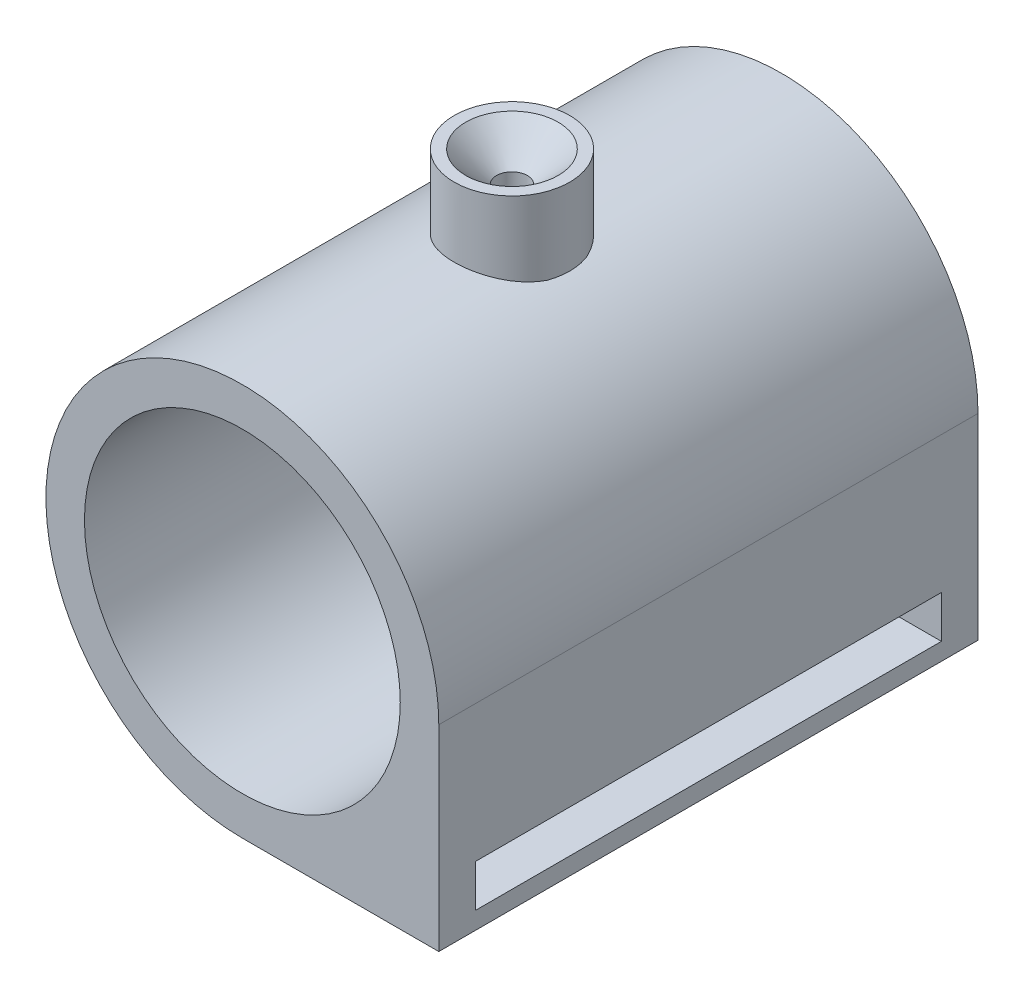
ISO-10303-21;
HEADER;
FILE_DESCRIPTION(('STEP AP214'),'2;1');
FILE_NAME('part.step','',(''),(''),'','','');
FILE_SCHEMA(('AUTOMOTIVE_DESIGN { 1 0 10303 214 1 1 1 1 }'));
ENDSEC;
DATA;
#1=APPLICATION_CONTEXT('core data for automotive mechanical design processes');
#2=APPLICATION_PROTOCOL_DEFINITION('international standard','automotive_design',2000,#1);
#3=PRODUCT_CONTEXT('',#1,'mechanical');
#4=PRODUCT('Part','Part','',(#3));
#5=PRODUCT_RELATED_PRODUCT_CATEGORY('part','',(#4));
#6=PRODUCT_DEFINITION_FORMATION('','',#4);
#7=PRODUCT_DEFINITION_CONTEXT('part definition',#1,'design');
#8=PRODUCT_DEFINITION('design','',#6,#7);
#9=PRODUCT_DEFINITION_SHAPE('','',#8);
#10=(LENGTH_UNIT() NAMED_UNIT(*) SI_UNIT(.MILLI.,.METRE.));
#11=(NAMED_UNIT(*) PLANE_ANGLE_UNIT() SI_UNIT($,.RADIAN.));
#12=(NAMED_UNIT(*) SI_UNIT($,.STERADIAN.) SOLID_ANGLE_UNIT());
#13=UNCERTAINTY_MEASURE_WITH_UNIT(LENGTH_MEASURE(1.E-05),#10,'distance_accuracy_value','');
#14=(GEOMETRIC_REPRESENTATION_CONTEXT(3) GLOBAL_UNCERTAINTY_ASSIGNED_CONTEXT((#13)) GLOBAL_UNIT_ASSIGNED_CONTEXT((#10,
#11,#12)) REPRESENTATION_CONTEXT('',''));
#15=CARTESIAN_POINT('',(0.,0.,0.));
#16=DIRECTION('',(0.,0.,1.));
#17=DIRECTION('',(1.,0.,0.));
#18=AXIS2_PLACEMENT_3D('',#15,#16,#17);
#19=CARTESIAN_POINT('',(-77.5,0.,35.));
#20=DIRECTION('',(1.,0.,0.));
#21=DIRECTION('',(0.,1.,0.));
#22=AXIS2_PLACEMENT_3D('',#19,#20,#21);
#23=PLANE('',#22);
#24=DIRECTION('',(0.,1.,0.));
#25=VECTOR('',#24,1.);
#26=CARTESIAN_POINT('',(-77.5,7.75,-30.25));
#27=LINE('',#26,#25);
#28=CARTESIAN_POINT('',(-77.5,2.25,-30.25));
#29=VERTEX_POINT('',#28);
#30=CARTESIAN_POINT('',(-77.5,7.75,-30.25));
#31=VERTEX_POINT('',#30);
#32=EDGE_CURVE('E55',#29,#31,#27,.T.);
#33=ORIENTED_EDGE('',*,*,#32,.F.);
#34=DIRECTION('',(0.,0.,-1.));
#35=VECTOR('',#34,1.);
#36=CARTESIAN_POINT('',(-77.5,2.25,30.25));
#37=LINE('',#36,#35);
#38=CARTESIAN_POINT('',(-77.5,2.25,30.25));
#39=VERTEX_POINT('',#38);
#40=EDGE_CURVE('E131',#39,#29,#37,.T.);
#41=ORIENTED_EDGE('',*,*,#40,.F.);
#42=DIRECTION('',(0.,-1.,0.));
#43=VECTOR('',#42,1.);
#44=CARTESIAN_POINT('',(-77.5,7.75,30.25));
#45=LINE('',#44,#43);
#46=CARTESIAN_POINT('',(-77.5,7.75,30.25));
#47=VERTEX_POINT('',#46);
#48=EDGE_CURVE('E134',#47,#39,#45,.T.);
#49=ORIENTED_EDGE('',*,*,#48,.F.);
#50=DIRECTION('',(0.,0.,1.));
#51=VECTOR('',#50,1.);
#52=CARTESIAN_POINT('',(-77.5,7.75,30.25));
#53=LINE('',#52,#51);
#54=EDGE_CURVE('E140',#31,#47,#53,.T.);
#55=ORIENTED_EDGE('',*,*,#54,.F.);
#56=EDGE_LOOP('',(#33,#41,#49,#55));
#57=FACE_BOUND('',#56,.T.);
#58=DIRECTION('',(0.,-1.,0.));
#59=VECTOR('',#58,1.);
#60=CARTESIAN_POINT('',(-77.5,0.,35.));
#61=LINE('',#60,#59);
#62=CARTESIAN_POINT('',(-77.5,25.5,35.));
#63=VERTEX_POINT('',#62);
#64=CARTESIAN_POINT('',(-77.5,0.,35.));
#65=VERTEX_POINT('',#64);
#66=EDGE_CURVE('E62',#63,#65,#61,.T.);
#67=ORIENTED_EDGE('',*,*,#66,.T.);
#68=DIRECTION('',(0.,0.,-1.));
#69=VECTOR('',#68,1.);
#70=CARTESIAN_POINT('',(-77.5,0.,0.));
#71=LINE('',#70,#69);
#72=CARTESIAN_POINT('',(-77.5,0.,-35.));
#73=VERTEX_POINT('',#72);
#74=EDGE_CURVE('E11',#65,#73,#71,.T.);
#75=ORIENTED_EDGE('',*,*,#74,.T.);
#76=DIRECTION('',(0.,-1.,0.));
#77=VECTOR('',#76,1.);
#78=CARTESIAN_POINT('',(-77.5,0.,-35.));
#79=LINE('',#78,#77);
#80=CARTESIAN_POINT('',(-77.5,25.5,-35.));
#81=VERTEX_POINT('',#80);
#82=EDGE_CURVE('E263',#81,#73,#79,.T.);
#83=ORIENTED_EDGE('',*,*,#82,.F.);
#84=DIRECTION('',(0.,0.,-1.));
#85=VECTOR('',#84,1.);
#86=CARTESIAN_POINT('',(-77.5,25.5,35.));
#87=LINE('',#86,#85);
#88=EDGE_CURVE('E265',#63,#81,#87,.T.);
#89=ORIENTED_EDGE('',*,*,#88,.F.);
#90=EDGE_LOOP('',(#67,#75,#83,#89));
#91=FACE_BOUND('',#90,.T.);
#92=ADVANCED_FACE('F39',(#57,#91),#23,.T.);
#93=CARTESIAN_POINT('',(-103.,56.,0.));
#94=DIRECTION('',(0.,1.,0.));
#95=DIRECTION('',(0.,0.,1.));
#96=AXIS2_PLACEMENT_3D('',#93,#94,#95);
#97=CONICAL_SURFACE('',#96,2.,0.785398163397447);
#98=CARTESIAN_POINT('',(-103.,60.,0.));
#99=DIRECTION('',(0.,1.,0.));
#100=DIRECTION('',(0.,0.,1.));
#101=AXIS2_PLACEMENT_3D('',#98,#99,#100);
#102=CIRCLE('',#101,6.00000000000001);
#103=CARTESIAN_POINT('',(-103.,60.,5.99999999999999));
#104=VERTEX_POINT('',#103);
#105=EDGE_CURVE('E48',#104,#104,#102,.F.);
#106=CARTESIAN_POINT('',(-103.,56.,0.));
#107=DIRECTION('',(0.,1.,0.));
#108=DIRECTION('',(0.,0.,1.));
#109=AXIS2_PLACEMENT_3D('',#106,#107,#108);
#110=CIRCLE('',#109,2.);
#111=CARTESIAN_POINT('',(-103.,56.,1.99999999999999));
#112=VERTEX_POINT('',#111);
#113=EDGE_CURVE('E286',#112,#112,#110,.T.);
#114=CARTESIAN_POINT('',(-103.,60.,5.99999999999999));
#115=CARTESIAN_POINT('',(-103.,59.9583333333333,5.95833333333333));
#116=CARTESIAN_POINT('',(-103.,59.9166666666667,5.91666666666666));
#117=CARTESIAN_POINT('',(-103.,59.8333333333333,5.83333333333333));
#118=CARTESIAN_POINT('',(-103.,59.7916666666667,5.79166666666666));
#119=CARTESIAN_POINT('',(-103.,59.7083333333333,5.70833333333333));
#120=CARTESIAN_POINT('',(-103.,59.6666666666667,5.66666666666666));
#121=CARTESIAN_POINT('',(-103.,59.5833333333333,5.58333333333333));
#122=CARTESIAN_POINT('',(-103.,59.5416666666667,5.54166666666666));
#123=CARTESIAN_POINT('',(-103.,59.4583333333333,5.45833333333333));
#124=CARTESIAN_POINT('',(-103.,59.4166666666667,5.41666666666666));
#125=CARTESIAN_POINT('',(-103.,59.3333333333333,5.33333333333333));
#126=CARTESIAN_POINT('',(-103.,59.2916666666667,5.29166666666666));
#127=CARTESIAN_POINT('',(-103.,59.2083333333333,5.20833333333333));
#128=CARTESIAN_POINT('',(-103.,59.1666666666667,5.16666666666666));
#129=CARTESIAN_POINT('',(-103.,59.0833333333333,5.08333333333333));
#130=CARTESIAN_POINT('',(-103.,59.0416666666667,5.04166666666666));
#131=CARTESIAN_POINT('',(-103.,58.9583333333333,4.95833333333333));
#132=CARTESIAN_POINT('',(-103.,58.9166666666667,4.91666666666666));
#133=CARTESIAN_POINT('',(-103.,58.8333333333333,4.83333333333333));
#134=CARTESIAN_POINT('',(-103.,58.7916666666667,4.79166666666666));
#135=CARTESIAN_POINT('',(-103.,58.7083333333333,4.70833333333333));
#136=CARTESIAN_POINT('',(-103.,58.6666666666667,4.66666666666666));
#137=CARTESIAN_POINT('',(-103.,58.5833333333333,4.58333333333333));
#138=CARTESIAN_POINT('',(-103.,58.5416666666667,4.54166666666666));
#139=CARTESIAN_POINT('',(-103.,58.4583333333333,4.45833333333332));
#140=CARTESIAN_POINT('',(-103.,58.4166666666667,4.41666666666666));
#141=CARTESIAN_POINT('',(-103.,58.3333333333333,4.33333333333332));
#142=CARTESIAN_POINT('',(-103.,58.2916666666667,4.29166666666666));
#143=CARTESIAN_POINT('',(-103.,58.2083333333333,4.20833333333332));
#144=CARTESIAN_POINT('',(-103.,58.1666666666667,4.16666666666666));
#145=CARTESIAN_POINT('',(-103.,58.0833333333333,4.08333333333332));
#146=CARTESIAN_POINT('',(-103.,58.0416666666667,4.04166666666666));
#147=CARTESIAN_POINT('',(-103.,57.9583333333333,3.95833333333332));
#148=CARTESIAN_POINT('',(-103.,57.9166666666667,3.91666666666666));
#149=CARTESIAN_POINT('',(-103.,57.8333333333333,3.83333333333332));
#150=CARTESIAN_POINT('',(-103.,57.7916666666667,3.79166666666666));
#151=CARTESIAN_POINT('',(-103.,57.7083333333333,3.70833333333332));
#152=CARTESIAN_POINT('',(-103.,57.6666666666667,3.66666666666666));
#153=CARTESIAN_POINT('',(-103.,57.5833333333333,3.58333333333332));
#154=CARTESIAN_POINT('',(-103.,57.5416666666667,3.54166666666666));
#155=CARTESIAN_POINT('',(-103.,57.4583333333333,3.45833333333332));
#156=CARTESIAN_POINT('',(-103.,57.4166666666667,3.41666666666666));
#157=CARTESIAN_POINT('',(-103.,57.3333333333333,3.33333333333332));
#158=CARTESIAN_POINT('',(-103.,57.2916666666667,3.29166666666665));
#159=CARTESIAN_POINT('',(-103.,57.2083333333333,3.20833333333332));
#160=CARTESIAN_POINT('',(-103.,57.1666666666667,3.16666666666665));
#161=CARTESIAN_POINT('',(-103.,57.0833333333333,3.08333333333332));
#162=CARTESIAN_POINT('',(-103.,57.0416666666667,3.04166666666665));
#163=CARTESIAN_POINT('',(-103.,56.9583333333333,2.95833333333332));
#164=CARTESIAN_POINT('',(-103.,56.9166666666667,2.91666666666665));
#165=CARTESIAN_POINT('',(-103.,56.8333333333333,2.83333333333332));
#166=CARTESIAN_POINT('',(-103.,56.7916666666667,2.79166666666665));
#167=CARTESIAN_POINT('',(-103.,56.7083333333333,2.70833333333332));
#168=CARTESIAN_POINT('',(-103.,56.6666666666667,2.66666666666665));
#169=CARTESIAN_POINT('',(-103.,56.5833333333333,2.58333333333332));
#170=CARTESIAN_POINT('',(-103.,56.5416666666667,2.54166666666665));
#171=CARTESIAN_POINT('',(-103.,56.4583333333333,2.45833333333332));
#172=CARTESIAN_POINT('',(-103.,56.4166666666667,2.41666666666665));
#173=CARTESIAN_POINT('',(-103.,56.3333333333333,2.33333333333332));
#174=CARTESIAN_POINT('',(-103.,56.2916666666667,2.29166666666665));
#175=CARTESIAN_POINT('',(-103.,56.2083333333333,2.20833333333332));
#176=CARTESIAN_POINT('',(-103.,56.1666666666667,2.16666666666665));
#177=CARTESIAN_POINT('',(-103.,56.0833333333333,2.08333333333332));
#178=CARTESIAN_POINT('',(-103.,56.0416666666667,2.04166666666665));
#179=CARTESIAN_POINT('',(-103.,56.,1.99999999999999));
#180=B_SPLINE_CURVE_WITH_KNOTS('',3,(#114,#115,#116,#117,#118,#119,#120,#121,#122,#123,#124,
#125,#126,#127,#128,#129,#130,#131,#132,#133,#134,#135,#136,#137,#138,#139,#140,#141,#142,#143,
#144,#145,#146,#147,#148,#149,#150,#151,#152,#153,#154,#155,#156,#157,#158,#159,#160,#161,#162,
#163,#164,#165,#166,#167,#168,#169,#170,#171,#172,#173,#174,#175,#176,#177,#178,#179),
.UNSPECIFIED.,.F.,.F.,(4,2,2,2,2,2,2,2,2,2,2,2,2,2,2,2,2,2,2,2,2,2,2,2,2,2,2,2,2,2,2,2,4),(0.,
0.176776695296638,0.353553390593275,0.530330085889912,0.707106781186549,0.883883476483186,
1.06066017177982,1.23743686707646,1.4142135623731,1.59099025766973,1.76776695296637,
1.94454364826301,2.12132034355965,2.29809703885628,2.47487373415292,2.65165042944956,
2.8284271247462,3.00520382004284,3.18198051533947,3.35875721063611,3.53553390593275,
3.71231060122939,3.88908729652602,4.06586399182266,4.2426406871193,4.41941738241593,
4.59619407771257,4.77297077300921,4.94974746830585,5.12652416360248,5.30330085889912,
5.48007755419576,5.6568542494924),.UNSPECIFIED.);
#181=EDGE_CURVE('BSEAM42',#104,#112,#180,.T.);
#182=ORIENTED_EDGE('',*,*,#105,.F.);
#183=ORIENTED_EDGE('',*,*,#113,.F.);
#184=ORIENTED_EDGE('',*,*,#181,.T.);
#185=ORIENTED_EDGE('',*,*,#181,.F.);
#186=EDGE_LOOP('',(#182,#184,#183,#185));
#187=FACE_BOUND('',#186,.T.);
#188=ADVANCED_FACE('F42',(#187),#97,.F.);
#189=CARTESIAN_POINT('',(-103.,-0.001000000000001,0.));
#190=DIRECTION('',(0.,1.,0.));
#191=DIRECTION('',(0.,0.,1.));
#192=AXIS2_PLACEMENT_3D('',#189,#190,#191);
#193=CYLINDRICAL_SURFACE('',#192,2.);
#194=ORIENTED_EDGE('',*,*,#113,.T.);
#195=EDGE_LOOP('',(#194));
#196=FACE_BOUND('',#195,.T.);
#197=CARTESIAN_POINT('',(-103.,46.,1.99999999999999));
#198=CARTESIAN_POINT('',(-103.112055118297,45.9999987386317,1.99999514060117));
#199=CARTESIAN_POINT('',(-103.22418466831,45.999071475106,1.99055103639975));
#200=CARTESIAN_POINT('',(-103.445336088255,45.995461599852,1.95301866639838));
#201=CARTESIAN_POINT('',(-103.554354379701,45.992777045632,1.92490976822595));
#202=CARTESIAN_POINT('',(-103.766048698073,45.9859556789613,1.85087302777091));
#203=CARTESIAN_POINT('',(-103.86872847494,45.9818197350429,1.80495584049775));
#204=CARTESIAN_POINT('',(-104.064900752455,45.9725582727556,1.69662637479773));
#205=CARTESIAN_POINT('',(-104.158395096562,45.9674329535627,1.63421741547872));
#206=CARTESIAN_POINT('',(-104.333886297143,45.9567473510947,1.49444580813626));
#207=CARTESIAN_POINT('',(-104.415847200191,45.9511857883102,1.41703811216867));
#208=CARTESIAN_POINT('',(-104.565636011835,45.940265125924,1.24956231842826));
#209=CARTESIAN_POINT('',(-104.633463272044,45.93490603562,1.15949364014534));
#210=CARTESIAN_POINT('',(-104.753185959775,45.9249839183537,0.969028624111627));
#211=CARTESIAN_POINT('',(-104.80504898754,45.920422518314,0.868611828470055));
#212=CARTESIAN_POINT('',(-104.891164115931,45.9126279274825,0.660443008272744));
#213=CARTESIAN_POINT('',(-104.925416631999,45.9093947053588,0.552691156822688));
#214=CARTESIAN_POINT('',(-104.975232175371,45.9046339961254,0.333276682265682));
#215=CARTESIAN_POINT('',(-104.990854685748,45.9031010812673,0.221627683845366));
#216=CARTESIAN_POINT('',(-105.003150607662,45.9018976534529,-0.00271739116219227));
#217=CARTESIAN_POINT('',(-104.999824494757,45.9022270937568,-0.115413441400501));
#218=CARTESIAN_POINT('',(-104.974366634283,45.9047062007368,-0.33824393576703));
#219=CARTESIAN_POINT('',(-104.952299786513,45.9068495855721,-0.448385874249353));
#220=CARTESIAN_POINT('',(-104.890087811417,45.9127052572463,-0.66339537549614));
#221=CARTESIAN_POINT('',(-104.849942450481,45.9164175643586,-0.768262870084765));
#222=CARTESIAN_POINT('',(-104.752641229847,45.9250000260275,-0.969951979544357));
#223=CARTESIAN_POINT('',(-104.695456525324,45.9298721411142,-1.06675959194209));
#224=CARTESIAN_POINT('',(-104.565720618827,45.940223572557,-1.24942771363365));
#225=CARTESIAN_POINT('',(-104.493168988901,45.9457029058215,-1.33528791794737));
#226=CARTESIAN_POINT('',(-104.33439598481,45.9566793757017,-1.49400113346195));
#227=CARTESIAN_POINT('',(-104.248118552542,45.962176490598,-1.56679807872253));
#228=CARTESIAN_POINT('',(-104.064537843663,45.9725474048768,-1.69688395130023));
#229=CARTESIAN_POINT('',(-103.967234555576,45.9774212036104,-1.75417286247561));
#230=CARTESIAN_POINT('',(-103.764325751896,45.9859978296919,-1.85161400057713));
#231=CARTESIAN_POINT('',(-103.658718889056,45.9897004665282,-1.89176343981594));
#232=CARTESIAN_POINT('',(-103.442218792031,45.9955156024944,-1.95374513804601));
#233=CARTESIAN_POINT('',(-103.331325708391,45.9976281468793,-1.97557791834152));
#234=CARTESIAN_POINT('',(-103.107886619671,46.000019258317,-2.00023555075399));
#235=CARTESIAN_POINT('',(-102.995349230267,46.000305291138,-2.00313778152354));
#236=CARTESIAN_POINT('',(-102.771389624482,45.9990311576163,-1.99005508110186));
#237=CARTESIAN_POINT('',(-102.659967393791,45.9974710149938,-1.9740703925754));
#238=CARTESIAN_POINT('',(-102.44162388447,45.9926846542083,-1.92373178493305));
#239=CARTESIAN_POINT('',(-102.334694188217,45.9894617173387,-1.88941403884912));
#240=CARTESIAN_POINT('',(-102.128109577808,45.9817114137955,-1.80342060926111));
#241=CARTESIAN_POINT('',(-102.028454819343,45.9771840192152,-1.75174455440124));
#242=CARTESIAN_POINT('',(-101.838898703718,45.9673127926894,-1.63230909950557));
#243=CARTESIAN_POINT('',(-101.749029556731,45.9619663961097,-1.5644987940307));
#244=CARTESIAN_POINT('',(-101.581921623601,45.9510654935712,-1.41479279932738));
#245=CARTESIAN_POINT('',(-101.504683139044,45.9455109826469,-1.3328967738646));
#246=CARTESIAN_POINT('',(-101.36476089008,45.9347974735107,-1.15700672966077));
#247=CARTESIAN_POINT('',(-101.302127864042,45.9296398945817,-1.06297224944762));
#248=CARTESIAN_POINT('',(-101.193543110116,45.920325565535,-0.865674446724975));
#249=CARTESIAN_POINT('',(-101.147591163652,45.9161688023036,-0.762411245163314));
#250=CARTESIAN_POINT('',(-101.073758151703,45.9093354686106,-0.549762158182014));
#251=CARTESIAN_POINT('',(-101.04584675996,45.9066564152293,-0.440386885305484));
#252=CARTESIAN_POINT('',(-101.008788707772,45.9030740265504,-0.218474790289398));
#253=CARTESIAN_POINT('',(-100.999641537378,45.9021706429962,-0.105938054152022));
#254=CARTESIAN_POINT('',(-101.000378470131,45.9022428445945,0.118598171854959));
#255=CARTESIAN_POINT('',(-101.01018286763,45.903210560367,0.230597934394806));
#256=CARTESIAN_POINT('',(-101.04837764998,45.9068991531074,0.451351335463303));
#257=CARTESIAN_POINT('',(-101.076768057048,45.9096200321709,0.560104970111642));
#258=CARTESIAN_POINT('',(-101.151307242161,45.9165062113761,0.771279291333051));
#259=CARTESIAN_POINT('',(-101.197453818963,45.9206713324677,0.873700761083119));
#260=CARTESIAN_POINT('',(-101.306187101971,45.9299770492896,1.06935692983205));
#261=CARTESIAN_POINT('',(-101.368773690129,45.9351176380153,1.16259169479008));
#262=CARTESIAN_POINT('',(-101.508909847521,45.945820950492,1.33763631801491));
#263=CARTESIAN_POINT('',(-101.586518772401,45.9513852938365,1.41939855964621));
#264=CARTESIAN_POINT('',(-101.754380249558,45.9622943497929,1.56877512815348));
#265=CARTESIAN_POINT('',(-101.844635830585,45.9676390093949,1.63638605622624));
#266=CARTESIAN_POINT('',(-102.035465133274,45.977519777667,1.75566762454651));
#267=CARTESIAN_POINT('',(-102.136063223959,45.9820539044482,1.8072994123619));
#268=CARTESIAN_POINT('',(-102.344480533583,45.9897809682009,1.89286987758032));
#269=CARTESIAN_POINT('',(-102.452291428925,45.9929754212287,1.92682856548671));
#270=CARTESIAN_POINT('',(-102.633930640885,45.9968577956736,1.96759262216753));
#271=CARTESIAN_POINT('',(-102.706596682951,45.9980306482258,1.97972885570547));
#272=CARTESIAN_POINT('',(-102.852831115288,45.9996021631359,1.9959341248596));
#273=CARTESIAN_POINT('',(-102.926399502059,46.000000828497,2.00000319177006));
#274=CARTESIAN_POINT('',(-103.,46.,1.99999999999999));
#275=B_SPLINE_CURVE_WITH_KNOTS('',3,(#197,#198,#199,#200,#201,#202,#203,#204,#205,#206,#207,
#208,#209,#210,#211,#212,#213,#214,#215,#216,#217,#218,#219,#220,#221,#222,#223,#224,#225,#226,
#227,#228,#229,#230,#231,#232,#233,#234,#235,#236,#237,#238,#239,#240,#241,#242,#243,#244,#245,
#246,#247,#248,#249,#250,#251,#252,#253,#254,#255,#256,#257,#258,#259,#260,#261,#262,#263,#264,
#265,#266,#267,#268,#269,#270,#271,#272,#273,#274),.UNSPECIFIED.,.T.,.F.,(4,2,2,2,2,2,2,2,2,2,2,
2,2,2,2,2,2,2,2,2,2,2,2,2,2,2,2,2,2,2,2,2,2,2,2,2,2,2,4),(0.,0.335896599613486,
0.672165124399248,1.00823276348817,1.34423281758225,1.68125812727403,2.01829889472737,
2.35601925108153,2.69373164007185,3.03036284743264,3.36698560633151,3.70244736052759,
4.03791344968534,4.37395068598547,4.70999728178775,5.04745334324657,5.38490975594946,
5.72242103410452,6.05992270613898,6.39604397039322,6.73216091610809,7.06761710438999,
7.40308046972675,7.73961663418718,8.07616083307701,8.41385730311549,8.75154934809141,
9.08867224454339,9.42578597900945,9.76148498018369,10.097184382625,10.4328421815703,
10.7684975703674,11.105507305527,11.442597889628,11.7805017665503,12.1180222122315,
12.3386480369782,12.5592730058683),.UNSPECIFIED.);
#276=CARTESIAN_POINT('',(-103.,46.,1.99999999999999));
#277=VERTEX_POINT('',#276);
#278=EDGE_CURVE('E146',#277,#277,#275,.T.);
#279=ORIENTED_EDGE('',*,*,#278,.T.);
#280=EDGE_LOOP('',(#279));
#281=FACE_BOUND('',#280,.T.);
#282=ADVANCED_FACE('F160',(#196,#281),#193,.F.);
#283=CARTESIAN_POINT('',(-103.,60.,0.));
#284=DIRECTION('',(0.,1.,0.));
#285=DIRECTION('',(0.,0.,1.));
#286=AXIS2_PLACEMENT_3D('',#283,#284,#285);
#287=PLANE('',#286);
#288=ORIENTED_EDGE('',*,*,#105,.T.);
#289=EDGE_LOOP('',(#288));
#290=FACE_BOUND('',#289,.T.);
#291=CARTESIAN_POINT('',(-103.,60.,0.));
#292=DIRECTION('',(0.,1.,0.));
#293=DIRECTION('',(0.,0.,1.));
#294=AXIS2_PLACEMENT_3D('',#291,#292,#293);
#295=CIRCLE('',#294,7.50000000000001);
#296=CARTESIAN_POINT('',(-103.,60.,7.50000000000001));
#297=VERTEX_POINT('',#296);
#298=EDGE_CURVE('E158',#297,#297,#295,.T.);
#299=ORIENTED_EDGE('',*,*,#298,.T.);
#300=EDGE_LOOP('',(#299));
#301=FACE_BOUND('',#300,.T.);
#302=ADVANCED_FACE('F237',(#290,#301),#287,.T.);
#303=CARTESIAN_POINT('',(-103.,25.5,35.));
#304=DIRECTION('',(0.,0.,-1.));
#305=DIRECTION('',(-1.,0.,0.));
#306=AXIS2_PLACEMENT_3D('',#303,#304,#305);
#307=CYLINDRICAL_SURFACE('',#306,20.5);
#308=ORIENTED_EDGE('',*,*,#278,.F.);
#309=EDGE_LOOP('',(#308));
#310=FACE_BOUND('',#309,.T.);
#311=CARTESIAN_POINT('',(-103.,25.5,35.));
#312=DIRECTION('',(0.,0.,-1.));
#313=DIRECTION('',(-1.,0.,0.));
#314=AXIS2_PLACEMENT_3D('',#311,#312,#313);
#315=CIRCLE('',#314,20.5);
#316=CARTESIAN_POINT('',(-123.5,25.5,35.));
#317=VERTEX_POINT('',#316);
#318=EDGE_CURVE('E250',#317,#317,#315,.T.);
#319=ORIENTED_EDGE('',*,*,#318,.F.);
#320=EDGE_LOOP('',(#319));
#321=FACE_BOUND('',#320,.T.);
#322=CARTESIAN_POINT('',(-103.,25.5,-35.));
#323=DIRECTION('',(0.,0.,-1.));
#324=DIRECTION('',(-1.,0.,0.));
#325=AXIS2_PLACEMENT_3D('',#322,#323,#324);
#326=CIRCLE('',#325,20.5);
#327=CARTESIAN_POINT('',(-123.5,25.5,-35.));
#328=VERTEX_POINT('',#327);
#329=EDGE_CURVE('E253',#328,#328,#326,.T.);
#330=ORIENTED_EDGE('',*,*,#329,.T.);
#331=EDGE_LOOP('',(#330));
#332=FACE_BOUND('',#331,.T.);
#333=ADVANCED_FACE('F234',(#310,#321,#332),#307,.F.);
#334=CARTESIAN_POINT('',(-103.,50.,0.));
#335=DIRECTION('',(0.,1.,0.));
#336=DIRECTION('',(0.,0.,1.));
#337=AXIS2_PLACEMENT_3D('',#334,#335,#336);
#338=PLANE('',#337);
#339=DIRECTION('',(0.,0.,-1.));
#340=VECTOR('',#339,1.);
#341=CARTESIAN_POINT('',(-110.071067811865,50.,35.));
#342=LINE('',#341,#340);
#343=CARTESIAN_POINT('',(-110.071067811865,50.,2.50000000000016));
#344=VERTEX_POINT('',#343);
#345=CARTESIAN_POINT('',(-110.071067811865,50.,-2.50000000000018));
#346=VERTEX_POINT('',#345);
#347=EDGE_CURVE('E276',#344,#346,#342,.T.);
#348=ORIENTED_EDGE('',*,*,#347,.F.);
#349=CARTESIAN_POINT('',(-103.,50.,0.));
#350=DIRECTION('',(0.,1.,0.));
#351=DIRECTION('',(0.,0.,1.));
#352=AXIS2_PLACEMENT_3D('',#349,#350,#351);
#353=CIRCLE('',#352,7.50000000000001);
#354=EDGE_CURVE('E157',#346,#344,#353,.T.);
#355=ORIENTED_EDGE('',*,*,#354,.F.);
#356=EDGE_LOOP('',(#348,#355));
#357=FACE_BOUND('',#356,.T.);
#358=ADVANCED_FACE('F233',(#357),#338,.F.);
#359=DIRECTION('',(0.,0.,-1.));
#360=VECTOR('',#359,1.);
#361=CARTESIAN_POINT('',(-95.9289321881346,50.,35.));
#362=LINE('',#361,#360);
#363=CARTESIAN_POINT('',(-95.9289321881346,50.,-2.50000000000021));
#364=VERTEX_POINT('',#363);
#365=CARTESIAN_POINT('',(-95.9289321881346,50.,2.5000000000002));
#366=VERTEX_POINT('',#365);
#367=EDGE_CURVE('E224',#364,#366,#362,.F.);
#368=ORIENTED_EDGE('',*,*,#367,.F.);
#369=EDGE_CURVE('E258',#366,#364,#353,.T.);
#370=ORIENTED_EDGE('',*,*,#369,.F.);
#371=EDGE_LOOP('',(#368,#370));
#372=FACE_BOUND('',#371,.T.);
#373=ADVANCED_FACE('F231',(#372),#338,.F.);
#374=CARTESIAN_POINT('',(-103.,60.,0.));
#375=DIRECTION('',(0.,-1.,0.));
#376=DIRECTION('',(0.,0.,-1.));
#377=AXIS2_PLACEMENT_3D('',#374,#375,#376);
#378=CYLINDRICAL_SURFACE('',#377,7.50000000000001);
#379=CARTESIAN_POINT('',(-95.9289321881346,50.,2.50000000000022));
#380=CARTESIAN_POINT('',(-95.9997163011724,50.0204183295653,2.70026953235193));
#381=CARTESIAN_POINT('',(-96.078969436612,50.0429708535467,2.89730191613239));
#382=CARTESIAN_POINT('',(-96.2536602759481,50.0915688249665,3.28355477768137));
#383=CARTESIAN_POINT('',(-96.3490940956403,50.1176134338101,3.47277711674283));
#384=CARTESIAN_POINT('',(-96.5553238888429,50.1724031190231,3.84198410069792));
#385=CARTESIAN_POINT('',(-96.6661043428728,50.2011454579265,4.02197782931467));
#386=CARTESIAN_POINT('',(-96.9022895812246,50.2605080767262,4.37177999261605));
#387=CARTESIAN_POINT('',(-97.0276950273412,50.2911284415753,4.54158796585872));
#388=CARTESIAN_POINT('',(-97.2921918833454,50.3533572364444,4.86983903703142));
#389=CARTESIAN_POINT('',(-97.4312760006818,50.3849651339108,5.0282881136929));
#390=CARTESIAN_POINT('',(-97.7223196090127,50.4483120190481,5.33296238066997));
#391=CARTESIAN_POINT('',(-97.8742835336389,50.4800510482532,5.47918332698874));
#392=CARTESIAN_POINT('',(-98.1900558232129,50.542770219499,5.75837190467401));
#393=CARTESIAN_POINT('',(-98.3538630977859,50.5737504310508,5.89134075343955));
#394=CARTESIAN_POINT('',(-98.6922874189905,50.6341033314322,6.14313386873728));
#395=CARTESIAN_POINT('',(-98.8669043037073,50.6634760443278,6.26195834705703));
#396=CARTESIAN_POINT('',(-99.2276701188968,50.7200951845619,6.48575717772437));
#397=CARTESIAN_POINT('',(-99.4139190868619,50.7473166697997,6.59057671400558));
#398=CARTESIAN_POINT('',(-99.7949761576524,50.7985129921025,6.78405958784795));
#399=CARTESIAN_POINT('',(-99.9897812045818,50.8224889760434,6.87272863642042));
#400=CARTESIAN_POINT('',(-100.386656808964,50.866519207222,7.03322514558528));
#401=CARTESIAN_POINT('',(-100.588727791109,50.8865732247794,7.10505161988283));
#402=CARTESIAN_POINT('',(-100.998643098933,50.9221731122311,7.23122071075577));
#403=CARTESIAN_POINT('',(-101.206487235522,50.9377191295872,7.28556389923604));
#404=CARTESIAN_POINT('',(-101.620059233597,50.9634520991658,7.37490110742899));
#405=CARTESIAN_POINT('',(-101.825663061015,50.9737860294711,7.41042741136717));
#406=CARTESIAN_POINT('',(-102.239300740647,50.9894912877469,7.464236783542));
#407=CARTESIAN_POINT('',(-102.447334522145,50.9948627597708,7.48252035231248));
#408=CARTESIAN_POINT('',(-102.86423368138,51.0004905742762,7.50167337517276));
#409=CARTESIAN_POINT('',(-103.073098903161,51.0007478346493,7.50254595416292));
#410=CARTESIAN_POINT('',(-103.490116448715,50.9961421535399,7.48687659867276));
#411=CARTESIAN_POINT('',(-103.698268782791,50.9912792863721,7.47033491694687));
#412=CARTESIAN_POINT('',(-104.106380398626,50.9767820443591,7.42071194179897));
#413=CARTESIAN_POINT('',(-104.30640395217,50.9672878247333,7.38811621605223));
#414=CARTESIAN_POINT('',(-104.702974719899,50.9438469103447,7.30690470984299));
#415=CARTESIAN_POINT('',(-104.899520750041,50.9298987287368,7.25828357952052));
#416=CARTESIAN_POINT('',(-105.287696459078,50.8979205445278,7.1454385798919));
#417=CARTESIAN_POINT('',(-105.479327049322,50.8798913047552,7.08121762633019));
#418=CARTESIAN_POINT('',(-105.856465583336,50.8402163152299,6.93767380564797));
#419=CARTESIAN_POINT('',(-106.04197320633,50.8185703763599,6.85835014877685));
#420=CARTESIAN_POINT('',(-106.408341757614,50.7718777743815,6.68393346592119));
#421=CARTESIAN_POINT('',(-106.589095480981,50.7467861241888,6.58862735600824));
#422=CARTESIAN_POINT('',(-106.941957966968,50.6941023886495,6.38377542698363));
#423=CARTESIAN_POINT('',(-107.114066687015,50.666510290991,6.27422953775622));
#424=CARTESIAN_POINT('',(-107.448686131408,50.6095204214977,6.04158404415472));
#425=CARTESIAN_POINT('',(-107.611191651536,50.5801216878884,5.91847719238906));
#426=CARTESIAN_POINT('',(-107.925534271558,50.5202860816089,5.6595562618643));
#427=CARTESIAN_POINT('',(-108.07737132439,50.4898492043598,5.52374212705337));
#428=CARTESIAN_POINT('',(-108.375002971959,50.4275616225187,5.23487909985959));
#429=CARTESIAN_POINT('',(-108.520351710206,50.3957009900536,5.08137259136126));
#430=CARTESIAN_POINT('',(-108.79758496899,50.3326039209949,4.76262605408074));
#431=CARTESIAN_POINT('',(-108.929474225513,50.3013672679749,4.59739018744811));
#432=CARTESIAN_POINT('',(-109.178810764869,50.2404275581963,4.25639062330605));
#433=CARTESIAN_POINT('',(-109.296274371942,50.2107227904454,4.08063916678162));
#434=CARTESIAN_POINT('',(-109.516051214697,50.1536805085482,3.71963730790013));
#435=CARTESIAN_POINT('',(-109.618371781944,50.126341851519,3.53439156111816));
#436=CARTESIAN_POINT('',(-109.780977895322,50.0819720405697,3.20807539116987));
#437=CARTESIAN_POINT('',(-109.845055832132,50.0641834934536,3.06898354192604));
#438=CARTESIAN_POINT('',(-109.964566463457,50.030565025959,2.78715273253248));
#439=CARTESIAN_POINT('',(-110.020011927652,50.0147322198381,2.64441953004404));
#440=CARTESIAN_POINT('',(-110.071067811865,50.,2.50000000000015));
#441=B_SPLINE_CURVE_WITH_KNOTS('',3,(#379,#380,#381,#382,#383,#384,#385,#386,#387,#388,#389,
#390,#391,#392,#393,#394,#395,#396,#397,#398,#399,#400,#401,#402,#403,#404,#405,#406,#407,#408,
#409,#410,#411,#412,#413,#414,#415,#416,#417,#418,#419,#420,#421,#422,#423,#424,#425,#426,#427,
#428,#429,#430,#431,#432,#433,#434,#435,#436,#437,#438,#439,#440),.UNSPECIFIED.,.F.,.F.,(4,2,2,
2,2,2,2,2,2,2,2,2,2,2,2,2,2,2,2,2,2,2,2,2,2,2,2,2,2,2,4),(0.,0.639932883782017,1.2797123673782,
1.91884952556745,2.5580156165457,3.19684277539499,3.83589073863396,4.47487994175122,
5.11385957590296,5.75940319826486,6.40471810340001,7.05007078850207,7.69540236098892,
8.32134518085484,8.94726982986827,9.5730821377806,10.1988853626396,10.8068262508526,
11.4149702976453,12.0230007643012,12.6310630348252,13.2479921575818,13.864924318173,
14.4821878005454,15.0994540057953,15.7400705093722,16.3804608164322,17.0201196387715,
17.6594677472979,18.1217009242817,18.5832437047118),.UNSPECIFIED.);
#442=EDGE_CURVE('E217',#366,#344,#441,.T.);
#443=ORIENTED_EDGE('',*,*,#442,.F.);
#444=ORIENTED_EDGE('',*,*,#369,.T.);
#445=CARTESIAN_POINT('',(-110.071067811865,50.,-2.50000000000016));
#446=CARTESIAN_POINT('',(-110.000283698828,50.0204183295653,-2.70026953235187));
#447=CARTESIAN_POINT('',(-109.921030563388,50.0429708535467,-2.89730191613232));
#448=CARTESIAN_POINT('',(-109.746339724052,50.0915688249665,-3.2835547776813));
#449=CARTESIAN_POINT('',(-109.65090590436,50.1176134338101,-3.47277711674277));
#450=CARTESIAN_POINT('',(-109.444676111157,50.1724031190231,-3.84198410069786));
#451=CARTESIAN_POINT('',(-109.333895657127,50.2011454579265,-4.02197782931461));
#452=CARTESIAN_POINT('',(-109.097710418775,50.2605080767262,-4.371779992616));
#453=CARTESIAN_POINT('',(-108.972304972659,50.2911284415753,-4.54158796585867));
#454=CARTESIAN_POINT('',(-108.707808116655,50.3533572364444,-4.86983903703136));
#455=CARTESIAN_POINT('',(-108.568723999318,50.3849651339107,-5.02828811369285));
#456=CARTESIAN_POINT('',(-108.277680390987,50.4483120190481,-5.33296238066992));
#457=CARTESIAN_POINT('',(-108.125716466361,50.4800510482532,-5.47918332698869));
#458=CARTESIAN_POINT('',(-107.809944176787,50.542770219499,-5.75837190467397));
#459=CARTESIAN_POINT('',(-107.646136902214,50.5737504310508,-5.89134075343951));
#460=CARTESIAN_POINT('',(-107.30771258101,50.6341033314322,-6.14313386873724));
#461=CARTESIAN_POINT('',(-107.133095696293,50.6634760443278,-6.261958347057));
#462=CARTESIAN_POINT('',(-106.772329881103,50.7200951845619,-6.48575717772435));
#463=CARTESIAN_POINT('',(-106.586080913138,50.7473166697997,-6.59057671400555));
#464=CARTESIAN_POINT('',(-106.205023842348,50.7985129921025,-6.78405958784793));
#465=CARTESIAN_POINT('',(-106.010218795418,50.8224889760434,-6.8727286364204));
#466=CARTESIAN_POINT('',(-105.613343191036,50.866519207222,-7.03322514558526));
#467=CARTESIAN_POINT('',(-105.411272208891,50.8865732247794,-7.10505161988281));
#468=CARTESIAN_POINT('',(-105.001356901067,50.9221731122311,-7.23122071075576));
#469=CARTESIAN_POINT('',(-104.793512764478,50.9377191295872,-7.28556389923603));
#470=CARTESIAN_POINT('',(-104.379940766403,50.9634520991658,-7.37490110742899));
#471=CARTESIAN_POINT('',(-104.174336938985,50.9737860294711,-7.41042741136717));
#472=CARTESIAN_POINT('',(-103.760699259353,50.9894912877469,-7.46423678354201));
#473=CARTESIAN_POINT('',(-103.552665477855,50.9948627597708,-7.48252035231249));
#474=CARTESIAN_POINT('',(-103.13576631862,51.0004905742762,-7.50167337517277));
#475=CARTESIAN_POINT('',(-102.926901096839,51.0007478346493,-7.50254595416294));
#476=CARTESIAN_POINT('',(-102.509883551285,50.9961421535399,-7.48687659867278));
#477=CARTESIAN_POINT('',(-102.301731217209,50.9912792863721,-7.47033491694689));
#478=CARTESIAN_POINT('',(-101.893619601374,50.9767820443592,-7.420711941799));
#479=CARTESIAN_POINT('',(-101.69359604783,50.9672878247333,-7.38811621605226));
#480=CARTESIAN_POINT('',(-101.297025280102,50.9438469103447,-7.30690470984302));
#481=CARTESIAN_POINT('',(-101.10047924996,50.9298987287368,-7.25828357952055));
#482=CARTESIAN_POINT('',(-100.712303540922,50.8979205445278,-7.14543857989194));
#483=CARTESIAN_POINT('',(-100.520672950679,50.8798913047552,-7.08121762633023));
#484=CARTESIAN_POINT('',(-100.143534416664,50.8402163152299,-6.93767380564802));
#485=CARTESIAN_POINT('',(-99.9580267936699,50.8185703763599,-6.85835014877691));
#486=CARTESIAN_POINT('',(-99.5916582423862,50.7718777743815,-6.68393346592125));
#487=CARTESIAN_POINT('',(-99.4109045190196,50.7467861241888,-6.58862735600829));
#488=CARTESIAN_POINT('',(-99.0580420330324,50.6941023886495,-6.38377542698369));
#489=CARTESIAN_POINT('',(-98.8859333129852,50.666510290991,-6.27422953775628));
#490=CARTESIAN_POINT('',(-98.5513138685924,50.6095204214977,-6.04158404415478));
#491=CARTESIAN_POINT('',(-98.3888083484645,50.5801216878884,-5.91847719238911));
#492=CARTESIAN_POINT('',(-98.0744657284417,50.5202860816089,-5.65955626186435));
#493=CARTESIAN_POINT('',(-97.9226286756106,50.4898492043598,-5.52374212705343));
#494=CARTESIAN_POINT('',(-97.6249970280406,50.4275616225187,-5.23487909985966));
#495=CARTESIAN_POINT('',(-97.4796482897942,50.3957009900536,-5.08137259136134));
#496=CARTESIAN_POINT('',(-97.2024150310104,50.3326039209949,-4.76262605408083));
#497=CARTESIAN_POINT('',(-97.0705257744875,50.3013672679749,-4.5973901874482));
#498=CARTESIAN_POINT('',(-96.8211892351309,50.2404275581963,-4.25639062330614));
#499=CARTESIAN_POINT('',(-96.7037256280577,50.2107227904454,-4.0806391667817));
#500=CARTESIAN_POINT('',(-96.4839487853034,50.1536805085482,-3.71963730790022));
#501=CARTESIAN_POINT('',(-96.3816282180561,50.126341851519,-3.53439156111825));
#502=CARTESIAN_POINT('',(-96.219022104678,50.0819720405697,-3.20807539116997));
#503=CARTESIAN_POINT('',(-96.1549441678683,50.0641834934536,-3.06898354192614));
#504=CARTESIAN_POINT('',(-96.035433536543,50.030565025959,-2.78715273253257));
#505=CARTESIAN_POINT('',(-95.9799880723482,50.0147322198381,-2.64441953004413));
#506=CARTESIAN_POINT('',(-95.9289321881346,50.,-2.50000000000023));
#507=B_SPLINE_CURVE_WITH_KNOTS('',3,(#445,#446,#447,#448,#449,#450,#451,#452,#453,#454,#455,
#456,#457,#458,#459,#460,#461,#462,#463,#464,#465,#466,#467,#468,#469,#470,#471,#472,#473,#474,
#475,#476,#477,#478,#479,#480,#481,#482,#483,#484,#485,#486,#487,#488,#489,#490,#491,#492,#493,
#494,#495,#496,#497,#498,#499,#500,#501,#502,#503,#504,#505,#506),.UNSPECIFIED.,.F.,.F.,(4,2,2,
2,2,2,2,2,2,2,2,2,2,2,2,2,2,2,2,2,2,2,2,2,2,2,2,2,2,2,4),(0.,0.639932883782011,1.2797123673782,
1.91884952556744,2.55801561654569,3.19684277539499,3.83589073863395,4.47487994175121,
5.11385957590296,5.75940319826484,6.4047181034,7.05007078850207,7.6954023609889,
8.32134518085482,8.94726982986826,9.57308213778059,10.1988853626395,10.8068262508526,
11.4149702976453,12.0230007643012,12.6310630348252,13.2479921575818,13.864924318173,
14.4821878005455,15.0994540057953,15.7400705093722,16.3804608164322,17.0201196387715,
17.6594677472979,18.1217009242817,18.5832437047118),.UNSPECIFIED.);
#508=EDGE_CURVE('E209',#346,#364,#507,.T.);
#509=ORIENTED_EDGE('',*,*,#508,.F.);
#510=ORIENTED_EDGE('',*,*,#354,.T.);
#511=EDGE_LOOP('',(#443,#444,#509,#510));
#512=FACE_BOUND('',#511,.T.);
#513=ORIENTED_EDGE('',*,*,#298,.F.);
#514=EDGE_LOOP('',(#513));
#515=FACE_BOUND('',#514,.T.);
#516=ADVANCED_FACE('F226',(#512,#515),#378,.T.);
#517=CARTESIAN_POINT('',(-85.,10.,35.));
#518=DIRECTION('',(0.,0.,-1.));
#519=DIRECTION('',(-1.,0.,0.));
#520=AXIS2_PLACEMENT_3D('',#517,#518,#519);
#521=PLANE('',#520);
#522=ORIENTED_EDGE('',*,*,#318,.T.);
#523=EDGE_LOOP('',(#522));
#524=FACE_BOUND('',#523,.T.);
#525=DIRECTION('',(1.,0.,0.));
#526=VECTOR('',#525,1.);
#527=CARTESIAN_POINT('',(-85.,0.,35.));
#528=LINE('',#527,#526);
#529=CARTESIAN_POINT('',(-103.,0.,35.));
#530=VERTEX_POINT('',#529);
#531=EDGE_CURVE('E275',#530,#65,#528,.T.);
#532=ORIENTED_EDGE('',*,*,#531,.T.);
#533=ORIENTED_EDGE('',*,*,#66,.F.);
#534=CARTESIAN_POINT('',(-103.,25.5,35.));
#535=DIRECTION('',(0.,0.,-1.));
#536=DIRECTION('',(-1.,0.,0.));
#537=AXIS2_PLACEMENT_3D('',#534,#535,#536);
#538=CIRCLE('',#537,25.5);
#539=EDGE_CURVE('E260',#530,#63,#538,.T.);
#540=ORIENTED_EDGE('',*,*,#539,.F.);
#541=EDGE_LOOP('',(#532,#533,#540));
#542=FACE_BOUND('',#541,.T.);
#543=ADVANCED_FACE('F230',(#524,#542),#521,.F.);
#544=CARTESIAN_POINT('',(0.,0.,0.));
#545=DIRECTION('',(0.,1.,0.));
#546=DIRECTION('',(0.,0.,1.));
#547=AXIS2_PLACEMENT_3D('',#544,#545,#546);
#548=PLANE('',#547);
#549=ORIENTED_EDGE('',*,*,#74,.F.);
#550=ORIENTED_EDGE('',*,*,#531,.F.);
#551=DIRECTION('',(0.,0.,-1.));
#552=VECTOR('',#551,1.);
#553=CARTESIAN_POINT('',(-103.,0.,35.));
#554=LINE('',#553,#552);
#555=CARTESIAN_POINT('',(-103.,0.,-35.));
#556=VERTEX_POINT('',#555);
#557=EDGE_CURVE('E269',#530,#556,#554,.T.);
#558=ORIENTED_EDGE('',*,*,#557,.T.);
#559=DIRECTION('',(-1.,0.,0.));
#560=VECTOR('',#559,1.);
#561=CARTESIAN_POINT('',(-48.7339717240448,0.,-35.));
#562=LINE('',#561,#560);
#563=EDGE_CURVE('E272',#73,#556,#562,.T.);
#564=ORIENTED_EDGE('',*,*,#563,.F.);
#565=EDGE_LOOP('',(#549,#550,#558,#564));
#566=FACE_BOUND('',#565,.T.);
#567=ADVANCED_FACE('F200',(#566),#548,.F.);
#568=CARTESIAN_POINT('',(-48.7339717240448,10.,-35.));
#569=DIRECTION('',(0.,0.,1.));
#570=DIRECTION('',(1.,0.,0.));
#571=AXIS2_PLACEMENT_3D('',#568,#569,#570);
#572=PLANE('',#571);
#573=ORIENTED_EDGE('',*,*,#329,.F.);
#574=EDGE_LOOP('',(#573));
#575=FACE_BOUND('',#574,.T.);
#576=ORIENTED_EDGE('',*,*,#82,.T.);
#577=ORIENTED_EDGE('',*,*,#563,.T.);
#578=CARTESIAN_POINT('',(-103.,25.5,-35.));
#579=DIRECTION('',(0.,0.,-1.));
#580=DIRECTION('',(-1.,0.,0.));
#581=AXIS2_PLACEMENT_3D('',#578,#579,#580);
#582=CIRCLE('',#581,25.5);
#583=EDGE_CURVE('E255',#556,#81,#582,.T.);
#584=ORIENTED_EDGE('',*,*,#583,.T.);
#585=EDGE_LOOP('',(#576,#577,#584));
#586=FACE_BOUND('',#585,.T.);
#587=ADVANCED_FACE('F193',(#575,#586),#572,.F.);
#588=CARTESIAN_POINT('',(-103.,25.5,35.));
#589=DIRECTION('',(0.,0.,-1.));
#590=DIRECTION('',(-1.,0.,0.));
#591=AXIS2_PLACEMENT_3D('',#588,#589,#590);
#592=CYLINDRICAL_SURFACE('',#591,25.5);
#593=ORIENTED_EDGE('',*,*,#583,.F.);
#594=ORIENTED_EDGE('',*,*,#557,.F.);
#595=ORIENTED_EDGE('',*,*,#539,.T.);
#596=ORIENTED_EDGE('',*,*,#88,.T.);
#597=EDGE_LOOP('',(#593,#594,#595,#596));
#598=FACE_BOUND('',#597,.T.);
#599=ORIENTED_EDGE('',*,*,#508,.T.);
#600=ORIENTED_EDGE('',*,*,#367,.T.);
#601=ORIENTED_EDGE('',*,*,#442,.T.);
#602=ORIENTED_EDGE('',*,*,#347,.T.);
#603=EDGE_LOOP('',(#599,#600,#601,#602));
#604=FACE_BOUND('',#603,.T.);
#605=ADVANCED_FACE('F168',(#598,#604),#592,.T.);
#606=CARTESIAN_POINT('',(-88.,7.74999999999999,-30.25));
#607=DIRECTION('',(0.,0.,-1.));
#608=DIRECTION('',(-1.,0.,0.));
#609=AXIS2_PLACEMENT_3D('',#606,#607,#608);
#610=PLANE('',#609);
#611=ORIENTED_EDGE('',*,*,#32,.T.);
#612=DIRECTION('',(1.,0.,0.));
#613=VECTOR('',#612,1.);
#614=CARTESIAN_POINT('',(-88.,7.74999999999999,-30.25));
#615=LINE('',#614,#613);
#616=CARTESIAN_POINT('',(-88.,7.74999999999999,-30.25));
#617=VERTEX_POINT('',#616);
#618=EDGE_CURVE('E109',#617,#31,#615,.T.);
#619=ORIENTED_EDGE('',*,*,#618,.F.);
#620=DIRECTION('',(0.,1.,0.));
#621=VECTOR('',#620,1.);
#622=CARTESIAN_POINT('',(-88.,7.74999999999999,-30.25));
#623=LINE('',#622,#621);
#624=CARTESIAN_POINT('',(-88.,2.24999999999999,-30.25));
#625=VERTEX_POINT('',#624);
#626=EDGE_CURVE('E113',#625,#617,#623,.T.);
#627=ORIENTED_EDGE('',*,*,#626,.F.);
#628=DIRECTION('',(1.,0.,0.));
#629=VECTOR('',#628,1.);
#630=CARTESIAN_POINT('',(-88.,2.24999999999999,-30.25));
#631=LINE('',#630,#629);
#632=EDGE_CURVE('E144',#625,#29,#631,.T.);
#633=ORIENTED_EDGE('',*,*,#632,.T.);
#634=EDGE_LOOP('',(#611,#619,#627,#633));
#635=FACE_BOUND('',#634,.T.);
#636=ADVANCED_FACE('F111',(#635),#610,.F.);
#637=CARTESIAN_POINT('',(-88.,2.24999999999999,30.25));
#638=DIRECTION('',(0.,-1.,0.));
#639=DIRECTION('',(1.,0.,0.));
#640=AXIS2_PLACEMENT_3D('',#637,#638,#639);
#641=PLANE('',#640);
#642=ORIENTED_EDGE('',*,*,#40,.T.);
#643=ORIENTED_EDGE('',*,*,#632,.F.);
#644=DIRECTION('',(0.,0.,-1.));
#645=VECTOR('',#644,1.);
#646=CARTESIAN_POINT('',(-88.,2.24999999999999,30.25));
#647=LINE('',#646,#645);
#648=CARTESIAN_POINT('',(-88.,2.24999999999999,30.25));
#649=VERTEX_POINT('',#648);
#650=EDGE_CURVE('E119',#649,#625,#647,.T.);
#651=ORIENTED_EDGE('',*,*,#650,.F.);
#652=DIRECTION('',(1.,0.,0.));
#653=VECTOR('',#652,1.);
#654=CARTESIAN_POINT('',(-88.,2.24999999999999,30.25));
#655=LINE('',#654,#653);
#656=EDGE_CURVE('E147',#649,#39,#655,.T.);
#657=ORIENTED_EDGE('',*,*,#656,.T.);
#658=EDGE_LOOP('',(#642,#643,#651,#657));
#659=FACE_BOUND('',#658,.T.);
#660=ADVANCED_FACE('F167',(#659),#641,.F.);
#661=CARTESIAN_POINT('',(-88.,7.74999999999999,30.25));
#662=DIRECTION('',(0.,0.,1.));
#663=DIRECTION('',(1.,0.,0.));
#664=AXIS2_PLACEMENT_3D('',#661,#662,#663);
#665=PLANE('',#664);
#666=ORIENTED_EDGE('',*,*,#48,.T.);
#667=ORIENTED_EDGE('',*,*,#656,.F.);
#668=DIRECTION('',(0.,-1.,0.));
#669=VECTOR('',#668,1.);
#670=CARTESIAN_POINT('',(-88.,7.74999999999999,30.25));
#671=LINE('',#670,#669);
#672=CARTESIAN_POINT('',(-88.,7.74999999999999,30.25));
#673=VERTEX_POINT('',#672);
#674=EDGE_CURVE('E127',#673,#649,#671,.T.);
#675=ORIENTED_EDGE('',*,*,#674,.F.);
#676=DIRECTION('',(1.,0.,0.));
#677=VECTOR('',#676,1.);
#678=CARTESIAN_POINT('',(-88.,7.74999999999999,30.25));
#679=LINE('',#678,#677);
#680=EDGE_CURVE('E118',#673,#47,#679,.T.);
#681=ORIENTED_EDGE('',*,*,#680,.T.);
#682=EDGE_LOOP('',(#666,#667,#675,#681));
#683=FACE_BOUND('',#682,.T.);
#684=ADVANCED_FACE('F171',(#683),#665,.F.);
#685=CARTESIAN_POINT('',(-88.,7.74999999999999,30.25));
#686=DIRECTION('',(0.,1.,0.));
#687=DIRECTION('',(-1.,0.,0.));
#688=AXIS2_PLACEMENT_3D('',#685,#686,#687);
#689=PLANE('',#688);
#690=ORIENTED_EDGE('',*,*,#54,.T.);
#691=ORIENTED_EDGE('',*,*,#680,.F.);
#692=DIRECTION('',(0.,0.,1.));
#693=VECTOR('',#692,1.);
#694=CARTESIAN_POINT('',(-88.,7.74999999999999,30.25));
#695=LINE('',#694,#693);
#696=EDGE_CURVE('E122',#617,#673,#695,.T.);
#697=ORIENTED_EDGE('',*,*,#696,.F.);
#698=ORIENTED_EDGE('',*,*,#618,.T.);
#699=EDGE_LOOP('',(#690,#691,#697,#698));
#700=FACE_BOUND('',#699,.T.);
#701=ADVANCED_FACE('F123',(#700),#689,.F.);
#702=CARTESIAN_POINT('',(-88.,0.,0.));
#703=DIRECTION('',(1.,0.,0.));
#704=DIRECTION('',(0.,0.,-1.));
#705=AXIS2_PLACEMENT_3D('',#702,#703,#704);
#706=PLANE('',#705);
#707=ORIENTED_EDGE('',*,*,#626,.T.);
#708=ORIENTED_EDGE('',*,*,#696,.T.);
#709=ORIENTED_EDGE('',*,*,#674,.T.);
#710=ORIENTED_EDGE('',*,*,#650,.T.);
#711=EDGE_LOOP('',(#707,#708,#709,#710));
#712=FACE_BOUND('',#711,.T.);
#713=ADVANCED_FACE('F129',(#712),#706,.T.);
#714=CLOSED_SHELL('',(#92,#188,#282,#302,#333,#358,#373,#516,#543,#567,#587,#605,#636,#660,#684,
#701,#713));
#715=MANIFOLD_SOLID_BREP('B2',#714);
#716=ADVANCED_BREP_SHAPE_REPRESENTATION('',(#18,#715),#14);
#717=SHAPE_DEFINITION_REPRESENTATION(#9,#716);
ENDSEC;
END-ISO-10303-21;
